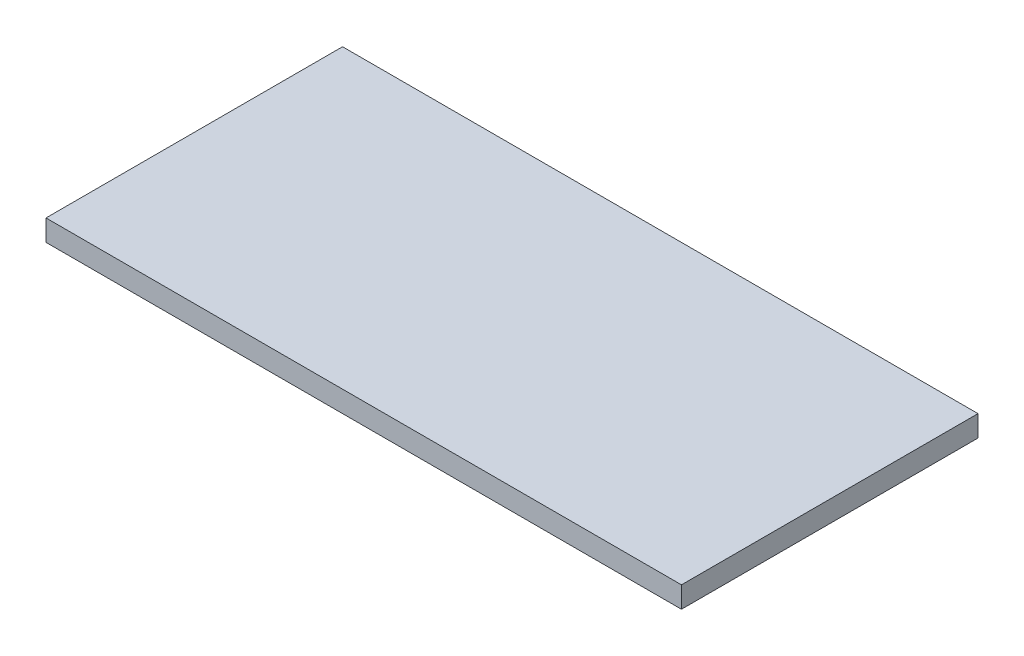
ISO-10303-21;
HEADER;
FILE_DESCRIPTION(('STEP AP214'),'2;1');
FILE_NAME('part.step','',(''),(''),'','','');
FILE_SCHEMA(('AUTOMOTIVE_DESIGN { 1 0 10303 214 1 1 1 1 }'));
ENDSEC;
DATA;
#1=APPLICATION_CONTEXT('core data for automotive mechanical design processes');
#2=APPLICATION_PROTOCOL_DEFINITION('international standard','automotive_design',2000,#1);
#3=PRODUCT_CONTEXT('',#1,'mechanical');
#4=PRODUCT('Part','Part','',(#3));
#5=PRODUCT_RELATED_PRODUCT_CATEGORY('part','',(#4));
#6=PRODUCT_DEFINITION_FORMATION('','',#4);
#7=PRODUCT_DEFINITION_CONTEXT('part definition',#1,'design');
#8=PRODUCT_DEFINITION('design','',#6,#7);
#9=PRODUCT_DEFINITION_SHAPE('','',#8);
#10=(LENGTH_UNIT() NAMED_UNIT(*) SI_UNIT(.MILLI.,.METRE.));
#11=(NAMED_UNIT(*) PLANE_ANGLE_UNIT() SI_UNIT($,.RADIAN.));
#12=(NAMED_UNIT(*) SI_UNIT($,.STERADIAN.) SOLID_ANGLE_UNIT());
#13=UNCERTAINTY_MEASURE_WITH_UNIT(LENGTH_MEASURE(1.E-05),#10,'distance_accuracy_value','');
#14=(GEOMETRIC_REPRESENTATION_CONTEXT(3) GLOBAL_UNCERTAINTY_ASSIGNED_CONTEXT((#13)) GLOBAL_UNIT_ASSIGNED_CONTEXT((#10,
#11,#12)) REPRESENTATION_CONTEXT('',''));
#15=CARTESIAN_POINT('',(0.,0.,0.));
#16=DIRECTION('',(0.,0.,1.));
#17=DIRECTION('',(1.,0.,0.));
#18=AXIS2_PLACEMENT_3D('',#15,#16,#17);
#19=CARTESIAN_POINT('',(-77.3921200750469,5.,-30.0375234521576));
#20=DIRECTION('',(1.,0.,0.));
#21=DIRECTION('',(0.,0.,-1.));
#22=AXIS2_PLACEMENT_3D('',#19,#20,#21);
#23=PLANE('',#22);
#24=DIRECTION('',(0.,0.,1.));
#25=VECTOR('',#24,1.);
#26=CARTESIAN_POINT('',(-77.3921200750469,0.,-30.0375234521576));
#27=LINE('',#26,#25);
#28=CARTESIAN_POINT('',(-77.3921200750469,0.,-30.0375234521576));
#29=VERTEX_POINT('',#28);
#30=CARTESIAN_POINT('',(-77.3921200750469,0.,39.9624765478424));
#31=VERTEX_POINT('',#30);
#32=EDGE_CURVE('E107',#29,#31,#27,.T.);
#33=ORIENTED_EDGE('',*,*,#32,.T.);
#34=DIRECTION('',(0.,-1.,0.));
#35=VECTOR('',#34,1.);
#36=CARTESIAN_POINT('',(-77.3921200750469,5.,39.9624765478424));
#37=LINE('',#36,#35);
#38=CARTESIAN_POINT('',(-77.3921200750469,5.,39.9624765478424));
#39=VERTEX_POINT('',#38);
#40=EDGE_CURVE('E11',#39,#31,#37,.T.);
#41=ORIENTED_EDGE('',*,*,#40,.F.);
#42=DIRECTION('',(0.,0.,1.));
#43=VECTOR('',#42,1.);
#44=CARTESIAN_POINT('',(-77.3921200750469,5.,-30.0375234521576));
#45=LINE('',#44,#43);
#46=CARTESIAN_POINT('',(-77.3921200750469,5.,-30.0375234521576));
#47=VERTEX_POINT('',#46);
#48=EDGE_CURVE('E91',#47,#39,#45,.T.);
#49=ORIENTED_EDGE('',*,*,#48,.F.);
#50=DIRECTION('',(0.,-1.,0.));
#51=VECTOR('',#50,1.);
#52=CARTESIAN_POINT('',(-77.3921200750469,5.,-30.0375234521576));
#53=LINE('',#52,#51);
#54=EDGE_CURVE('E103',#47,#29,#53,.T.);
#55=ORIENTED_EDGE('',*,*,#54,.T.);
#56=EDGE_LOOP('',(#33,#41,#49,#55));
#57=FACE_BOUND('',#56,.T.);
#58=ADVANCED_FACE('F39',(#57),#23,.F.);
#59=CARTESIAN_POINT('',(-77.3921200750469,5.,39.9624765478424));
#60=DIRECTION('',(0.,0.,-1.));
#61=DIRECTION('',(-1.,0.,0.));
#62=AXIS2_PLACEMENT_3D('',#59,#60,#61);
#63=PLANE('',#62);
#64=DIRECTION('',(1.,0.,0.));
#65=VECTOR('',#64,1.);
#66=CARTESIAN_POINT('',(-77.3921200750469,0.,39.9624765478424));
#67=LINE('',#66,#65);
#68=CARTESIAN_POINT('',(72.607879924953,0.,39.9624765478424));
#69=VERTEX_POINT('',#68);
#70=EDGE_CURVE('E96',#31,#69,#67,.T.);
#71=ORIENTED_EDGE('',*,*,#70,.T.);
#72=DIRECTION('',(0.,-1.,0.));
#73=VECTOR('',#72,1.);
#74=CARTESIAN_POINT('',(72.607879924953,5.,39.9624765478424));
#75=LINE('',#74,#73);
#76=CARTESIAN_POINT('',(72.607879924953,5.,39.9624765478424));
#77=VERTEX_POINT('',#76);
#78=EDGE_CURVE('E48',#77,#69,#75,.T.);
#79=ORIENTED_EDGE('',*,*,#78,.F.);
#80=DIRECTION('',(1.,0.,0.));
#81=VECTOR('',#80,1.);
#82=CARTESIAN_POINT('',(-77.3921200750469,5.,39.9624765478424));
#83=LINE('',#82,#81);
#84=EDGE_CURVE('E86',#39,#77,#83,.T.);
#85=ORIENTED_EDGE('',*,*,#84,.F.);
#86=ORIENTED_EDGE('',*,*,#40,.T.);
#87=EDGE_LOOP('',(#71,#79,#85,#86));
#88=FACE_BOUND('',#87,.T.);
#89=ADVANCED_FACE('F95',(#88),#63,.F.);
#90=CARTESIAN_POINT('',(72.6078799249531,5.,-30.0375234521576));
#91=DIRECTION('',(-1.,0.,0.));
#92=DIRECTION('',(0.,0.,1.));
#93=AXIS2_PLACEMENT_3D('',#90,#91,#92);
#94=PLANE('',#93);
#95=DIRECTION('',(0.,0.,-1.));
#96=VECTOR('',#95,1.);
#97=CARTESIAN_POINT('',(72.6078799249531,0.,-30.0375234521576));
#98=LINE('',#97,#96);
#99=CARTESIAN_POINT('',(72.6078799249531,0.,-30.0375234521576));
#100=VERTEX_POINT('',#99);
#101=EDGE_CURVE('E73',#69,#100,#98,.T.);
#102=ORIENTED_EDGE('',*,*,#101,.T.);
#103=DIRECTION('',(0.,-1.,0.));
#104=VECTOR('',#103,1.);
#105=CARTESIAN_POINT('',(72.6078799249531,5.,-30.0375234521576));
#106=LINE('',#105,#104);
#107=CARTESIAN_POINT('',(72.6078799249531,5.,-30.0375234521576));
#108=VERTEX_POINT('',#107);
#109=EDGE_CURVE('E98',#108,#100,#106,.T.);
#110=ORIENTED_EDGE('',*,*,#109,.F.);
#111=DIRECTION('',(0.,0.,-1.));
#112=VECTOR('',#111,1.);
#113=CARTESIAN_POINT('',(72.6078799249531,5.,-30.0375234521576));
#114=LINE('',#113,#112);
#115=EDGE_CURVE('E89',#77,#108,#114,.T.);
#116=ORIENTED_EDGE('',*,*,#115,.F.);
#117=ORIENTED_EDGE('',*,*,#78,.T.);
#118=EDGE_LOOP('',(#102,#110,#116,#117));
#119=FACE_BOUND('',#118,.T.);
#120=ADVANCED_FACE('F99',(#119),#94,.F.);
#121=CARTESIAN_POINT('',(-77.3921200750469,5.,-30.0375234521576));
#122=DIRECTION('',(0.,0.,1.));
#123=DIRECTION('',(1.,0.,0.));
#124=AXIS2_PLACEMENT_3D('',#121,#122,#123);
#125=PLANE('',#124);
#126=DIRECTION('',(-1.,0.,0.));
#127=VECTOR('',#126,1.);
#128=CARTESIAN_POINT('',(-77.3921200750469,0.,-30.0375234521576));
#129=LINE('',#128,#127);
#130=EDGE_CURVE('E79',#100,#29,#129,.T.);
#131=ORIENTED_EDGE('',*,*,#130,.T.);
#132=ORIENTED_EDGE('',*,*,#54,.F.);
#133=DIRECTION('',(-1.,0.,0.));
#134=VECTOR('',#133,1.);
#135=CARTESIAN_POINT('',(-77.3921200750469,5.,-30.0375234521576));
#136=LINE('',#135,#134);
#137=EDGE_CURVE('E56',#108,#47,#136,.T.);
#138=ORIENTED_EDGE('',*,*,#137,.F.);
#139=ORIENTED_EDGE('',*,*,#109,.T.);
#140=EDGE_LOOP('',(#131,#132,#138,#139));
#141=FACE_BOUND('',#140,.T.);
#142=ADVANCED_FACE('F120',(#141),#125,.F.);
#143=CARTESIAN_POINT('',(0.,5.,0.));
#144=DIRECTION('',(0.,1.,0.));
#145=DIRECTION('',(0.,0.,1.));
#146=AXIS2_PLACEMENT_3D('',#143,#144,#145);
#147=PLANE('',#146);
#148=ORIENTED_EDGE('',*,*,#48,.T.);
#149=ORIENTED_EDGE('',*,*,#84,.T.);
#150=ORIENTED_EDGE('',*,*,#115,.T.);
#151=ORIENTED_EDGE('',*,*,#137,.T.);
#152=EDGE_LOOP('',(#148,#149,#150,#151));
#153=FACE_BOUND('',#152,.T.);
#154=ADVANCED_FACE('F87',(#153),#147,.T.);
#155=CARTESIAN_POINT('',(0.,0.,0.));
#156=DIRECTION('',(0.,1.,0.));
#157=DIRECTION('',(0.,0.,1.));
#158=AXIS2_PLACEMENT_3D('',#155,#156,#157);
#159=PLANE('',#158);
#160=ORIENTED_EDGE('',*,*,#32,.F.);
#161=ORIENTED_EDGE('',*,*,#130,.F.);
#162=ORIENTED_EDGE('',*,*,#101,.F.);
#163=ORIENTED_EDGE('',*,*,#70,.F.);
#164=EDGE_LOOP('',(#160,#161,#162,#163));
#165=FACE_BOUND('',#164,.T.);
#166=ADVANCED_FACE('F123',(#165),#159,.F.);
#167=CLOSED_SHELL('',(#58,#89,#120,#142,#154,#166));
#168=MANIFOLD_SOLID_BREP('B2',#167);
#169=ADVANCED_BREP_SHAPE_REPRESENTATION('',(#18,#168),#14);
#170=SHAPE_DEFINITION_REPRESENTATION(#9,#169);
ENDSEC;
END-ISO-10303-21;
